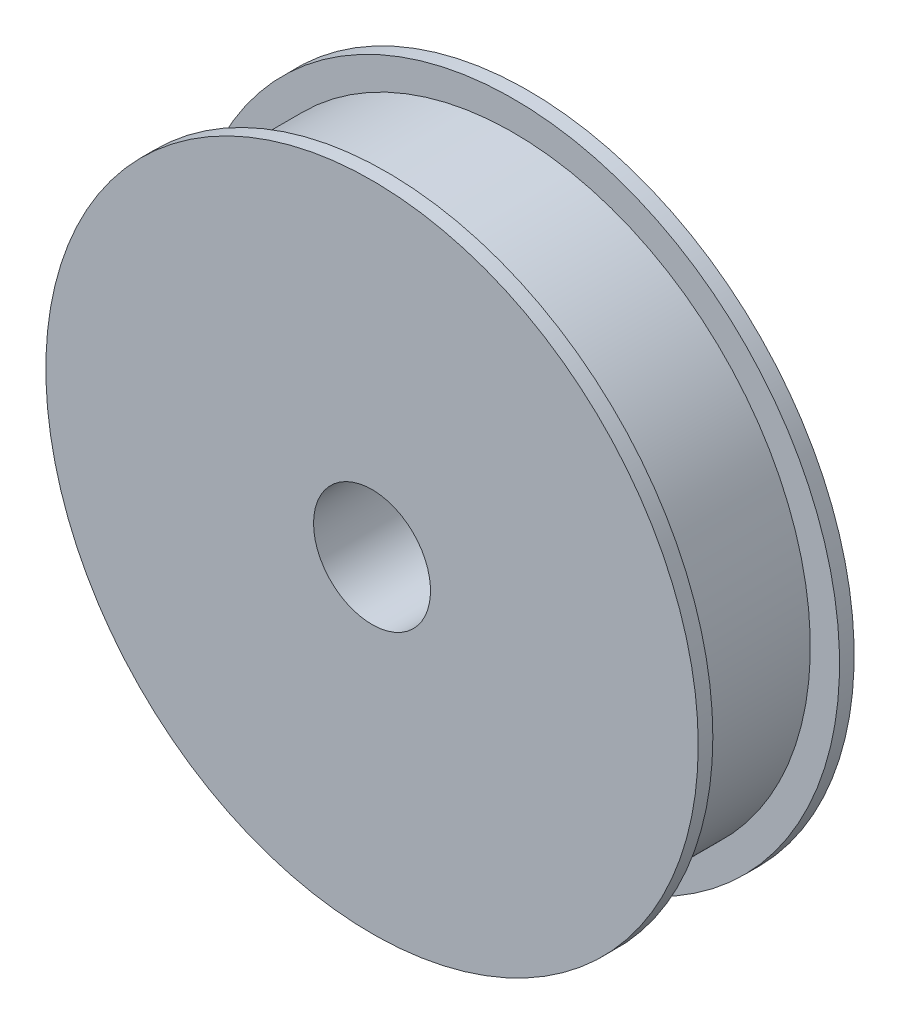
ISO-10303-21;
HEADER;
FILE_DESCRIPTION(('STEP AP214'),'2;1');
FILE_NAME('part.step','',(''),(''),'','','');
FILE_SCHEMA(('AUTOMOTIVE_DESIGN { 1 0 10303 214 1 1 1 1 }'));
ENDSEC;
DATA;
#1=APPLICATION_CONTEXT('core data for automotive mechanical design processes');
#2=APPLICATION_PROTOCOL_DEFINITION('international standard','automotive_design',2000,#1);
#3=PRODUCT_CONTEXT('',#1,'mechanical');
#4=PRODUCT('Part','Part','',(#3));
#5=PRODUCT_RELATED_PRODUCT_CATEGORY('part','',(#4));
#6=PRODUCT_DEFINITION_FORMATION('','',#4);
#7=PRODUCT_DEFINITION_CONTEXT('part definition',#1,'design');
#8=PRODUCT_DEFINITION('design','',#6,#7);
#9=PRODUCT_DEFINITION_SHAPE('','',#8);
#10=(LENGTH_UNIT() NAMED_UNIT(*) SI_UNIT(.MILLI.,.METRE.));
#11=(NAMED_UNIT(*) PLANE_ANGLE_UNIT() SI_UNIT($,.RADIAN.));
#12=(NAMED_UNIT(*) SI_UNIT($,.STERADIAN.) SOLID_ANGLE_UNIT());
#13=UNCERTAINTY_MEASURE_WITH_UNIT(LENGTH_MEASURE(1.E-05),#10,'distance_accuracy_value','');
#14=(GEOMETRIC_REPRESENTATION_CONTEXT(3) GLOBAL_UNCERTAINTY_ASSIGNED_CONTEXT((#13)) GLOBAL_UNIT_ASSIGNED_CONTEXT((#10,
#11,#12)) REPRESENTATION_CONTEXT('',''));
#15=CARTESIAN_POINT('',(0.,0.,0.));
#16=DIRECTION('',(0.,0.,1.));
#17=DIRECTION('',(1.,0.,0.));
#18=AXIS2_PLACEMENT_3D('',#15,#16,#17);
#19=CARTESIAN_POINT('',(0.,0.,14.5));
#20=DIRECTION('',(0.,0.,-1.));
#21=DIRECTION('',(-1.,0.,0.));
#22=AXIS2_PLACEMENT_3D('',#19,#20,#21);
#23=CYLINDRICAL_SURFACE('',#22,6.);
#24=CARTESIAN_POINT('',(0.,0.,14.5));
#25=DIRECTION('',(0.,0.,-1.));
#26=DIRECTION('',(-1.,0.,0.));
#27=AXIS2_PLACEMENT_3D('',#24,#25,#26);
#28=CIRCLE('',#27,6.);
#29=CARTESIAN_POINT('',(-6.,0.,14.5));
#30=VERTEX_POINT('',#29);
#31=EDGE_CURVE('E57',#30,#30,#28,.T.);
#32=ORIENTED_EDGE('',*,*,#31,.F.);
#33=EDGE_LOOP('',(#32));
#34=FACE_BOUND('',#33,.T.);
#35=CARTESIAN_POINT('',(0.,0.,3.5));
#36=DIRECTION('',(0.,0.,-1.));
#37=DIRECTION('',(-1.,0.,0.));
#38=AXIS2_PLACEMENT_3D('',#35,#36,#37);
#39=CIRCLE('',#38,6.);
#40=CARTESIAN_POINT('',(-6.,0.,3.5));
#41=VERTEX_POINT('',#40);
#42=EDGE_CURVE('E37',#41,#41,#39,.F.);
#43=ORIENTED_EDGE('',*,*,#42,.F.);
#44=EDGE_LOOP('',(#43));
#45=FACE_BOUND('',#44,.T.);
#46=ADVANCED_FACE('F33',(#34,#45),#23,.F.);
#47=CARTESIAN_POINT('',(0.,0.,13.));
#48=DIRECTION('',(0.,0.,-1.));
#49=DIRECTION('',(-1.,0.,0.));
#50=AXIS2_PLACEMENT_3D('',#47,#48,#49);
#51=CYLINDRICAL_SURFACE('',#50,30.47);
#52=CARTESIAN_POINT('',(0.,0.,13.));
#53=DIRECTION('',(0.,0.,1.));
#54=DIRECTION('',(1.,0.,0.));
#55=AXIS2_PLACEMENT_3D('',#52,#53,#54);
#56=CIRCLE('',#55,30.47);
#57=CARTESIAN_POINT('',(-30.47,0.,13.));
#58=VERTEX_POINT('',#57);
#59=EDGE_CURVE('E10',#58,#58,#56,.T.);
#60=CARTESIAN_POINT('',(0.,0.,0.));
#61=DIRECTION('',(0.,0.,-1.));
#62=DIRECTION('',(-1.,0.,0.));
#63=AXIS2_PLACEMENT_3D('',#60,#61,#62);
#64=CIRCLE('',#63,30.47);
#65=CARTESIAN_POINT('',(-30.47,0.,0.));
#66=VERTEX_POINT('',#65);
#67=EDGE_CURVE('E49',#66,#66,#64,.T.);
#68=CARTESIAN_POINT('',(-30.47,0.,13.));
#69=CARTESIAN_POINT('',(-30.47,0.,12.8645833333333));
#70=CARTESIAN_POINT('',(-30.47,0.,12.7291666666667));
#71=CARTESIAN_POINT('',(-30.47,0.,12.4583333333333));
#72=CARTESIAN_POINT('',(-30.47,0.,12.3229166666667));
#73=CARTESIAN_POINT('',(-30.47,0.,12.0520833333333));
#74=CARTESIAN_POINT('',(-30.47,0.,11.9166666666667));
#75=CARTESIAN_POINT('',(-30.47,0.,11.6458333333333));
#76=CARTESIAN_POINT('',(-30.47,0.,11.5104166666667));
#77=CARTESIAN_POINT('',(-30.47,0.,11.2395833333333));
#78=CARTESIAN_POINT('',(-30.47,0.,11.1041666666667));
#79=CARTESIAN_POINT('',(-30.47,0.,10.8333333333333));
#80=CARTESIAN_POINT('',(-30.47,0.,10.6979166666667));
#81=CARTESIAN_POINT('',(-30.47,0.,10.4270833333333));
#82=CARTESIAN_POINT('',(-30.47,0.,10.2916666666667));
#83=CARTESIAN_POINT('',(-30.47,0.,10.0208333333333));
#84=CARTESIAN_POINT('',(-30.47,0.,9.88541666666667));
#85=CARTESIAN_POINT('',(-30.47,0.,9.61458333333333));
#86=CARTESIAN_POINT('',(-30.47,0.,9.47916666666667));
#87=CARTESIAN_POINT('',(-30.47,0.,9.20833333333333));
#88=CARTESIAN_POINT('',(-30.47,0.,9.07291666666666));
#89=CARTESIAN_POINT('',(-30.47,0.,8.80208333333333));
#90=CARTESIAN_POINT('',(-30.47,0.,8.66666666666667));
#91=CARTESIAN_POINT('',(-30.47,0.,8.39583333333333));
#92=CARTESIAN_POINT('',(-30.47,0.,8.26041666666667));
#93=CARTESIAN_POINT('',(-30.47,0.,7.98958333333333));
#94=CARTESIAN_POINT('',(-30.47,0.,7.85416666666667));
#95=CARTESIAN_POINT('',(-30.47,0.,7.58333333333333));
#96=CARTESIAN_POINT('',(-30.47,0.,7.44791666666667));
#97=CARTESIAN_POINT('',(-30.47,0.,7.17708333333333));
#98=CARTESIAN_POINT('',(-30.47,0.,7.04166666666667));
#99=CARTESIAN_POINT('',(-30.47,0.,6.77083333333333));
#100=CARTESIAN_POINT('',(-30.47,0.,6.63541666666667));
#101=CARTESIAN_POINT('',(-30.47,0.,6.36458333333333));
#102=CARTESIAN_POINT('',(-30.47,0.,6.22916666666667));
#103=CARTESIAN_POINT('',(-30.47,0.,5.95833333333333));
#104=CARTESIAN_POINT('',(-30.47,0.,5.82291666666667));
#105=CARTESIAN_POINT('',(-30.47,0.,5.55208333333333));
#106=CARTESIAN_POINT('',(-30.47,0.,5.41666666666667));
#107=CARTESIAN_POINT('',(-30.47,0.,5.14583333333333));
#108=CARTESIAN_POINT('',(-30.47,0.,5.01041666666667));
#109=CARTESIAN_POINT('',(-30.47,0.,4.73958333333333));
#110=CARTESIAN_POINT('',(-30.47,0.,4.60416666666667));
#111=CARTESIAN_POINT('',(-30.47,0.,4.33333333333333));
#112=CARTESIAN_POINT('',(-30.47,0.,4.19791666666667));
#113=CARTESIAN_POINT('',(-30.47,0.,3.92708333333333));
#114=CARTESIAN_POINT('',(-30.47,0.,3.79166666666667));
#115=CARTESIAN_POINT('',(-30.47,0.,3.52083333333333));
#116=CARTESIAN_POINT('',(-30.47,0.,3.38541666666667));
#117=CARTESIAN_POINT('',(-30.47,0.,3.11458333333333));
#118=CARTESIAN_POINT('',(-30.47,0.,2.97916666666667));
#119=CARTESIAN_POINT('',(-30.47,0.,2.70833333333333));
#120=CARTESIAN_POINT('',(-30.47,0.,2.57291666666667));
#121=CARTESIAN_POINT('',(-30.47,0.,2.30208333333333));
#122=CARTESIAN_POINT('',(-30.47,0.,2.16666666666667));
#123=CARTESIAN_POINT('',(-30.47,0.,1.89583333333333));
#124=CARTESIAN_POINT('',(-30.47,0.,1.76041666666667));
#125=CARTESIAN_POINT('',(-30.47,0.,1.48958333333333));
#126=CARTESIAN_POINT('',(-30.47,0.,1.35416666666667));
#127=CARTESIAN_POINT('',(-30.47,0.,1.08333333333333));
#128=CARTESIAN_POINT('',(-30.47,0.,0.947916666666667));
#129=CARTESIAN_POINT('',(-30.47,0.,0.677083333333334));
#130=CARTESIAN_POINT('',(-30.47,0.,0.541666666666667));
#131=CARTESIAN_POINT('',(-30.47,0.,0.270833333333334));
#132=CARTESIAN_POINT('',(-30.47,0.,0.135416666666667));
#133=CARTESIAN_POINT('',(-30.47,0.,0.));
#134=B_SPLINE_CURVE_WITH_KNOTS('',3,(#68,#69,#70,#71,#72,#73,#74,#75,#76,#77,#78,#79,#80,#81,
#82,#83,#84,#85,#86,#87,#88,#89,#90,#91,#92,#93,#94,#95,#96,#97,#98,#99,#100,#101,#102,#103,
#104,#105,#106,#107,#108,#109,#110,#111,#112,#113,#114,#115,#116,#117,#118,#119,#120,#121,#122,
#123,#124,#125,#126,#127,#128,#129,#130,#131,#132,#133),.UNSPECIFIED.,.F.,.F.,(4,2,2,2,2,2,2,2,
2,2,2,2,2,2,2,2,2,2,2,2,2,2,2,2,2,2,2,2,2,2,2,2,4),(0.,0.40625,0.812500000000001,1.21875,1.625,
2.03125,2.4375,2.84375,3.25,3.65625,4.0625,4.46875,4.875,5.28125,5.6875,6.09375,6.5,6.90625,
7.3125,7.71875,8.125,8.53125,8.9375,9.34375,9.75,10.15625,10.5625,10.96875,11.375,11.78125,
12.1875,12.59375,13.),.UNSPECIFIED.);
#135=EDGE_CURVE('BSEAM35',#58,#66,#134,.T.);
#136=ORIENTED_EDGE('',*,*,#59,.F.);
#137=ORIENTED_EDGE('',*,*,#67,.F.);
#138=ORIENTED_EDGE('',*,*,#135,.T.);
#139=ORIENTED_EDGE('',*,*,#135,.F.);
#140=EDGE_LOOP('',(#136,#138,#137,#139));
#141=FACE_BOUND('',#140,.T.);
#142=ADVANCED_FACE('F35',(#141),#51,.T.);
#143=CARTESIAN_POINT('',(0.,0.,13.));
#144=DIRECTION('',(0.,0.,1.));
#145=DIRECTION('',(1.,0.,0.));
#146=AXIS2_PLACEMENT_3D('',#143,#144,#145);
#147=PLANE('',#146);
#148=CARTESIAN_POINT('',(0.,0.,13.));
#149=DIRECTION('',(0.,0.,1.));
#150=DIRECTION('',(1.,0.,0.));
#151=AXIS2_PLACEMENT_3D('',#148,#149,#150);
#152=CIRCLE('',#151,33.47);
#153=CARTESIAN_POINT('',(33.47,0.,13.));
#154=VERTEX_POINT('',#153);
#155=EDGE_CURVE('E45',#154,#154,#152,.T.);
#156=ORIENTED_EDGE('',*,*,#155,.F.);
#157=EDGE_LOOP('',(#156));
#158=FACE_BOUND('',#157,.T.);
#159=ORIENTED_EDGE('',*,*,#59,.T.);
#160=EDGE_LOOP('',(#159));
#161=FACE_BOUND('',#160,.T.);
#162=ADVANCED_FACE('F80',(#158,#161),#147,.F.);
#163=CARTESIAN_POINT('',(0.,0.,14.5));
#164=DIRECTION('',(0.,0.,-1.));
#165=DIRECTION('',(-1.,0.,0.));
#166=AXIS2_PLACEMENT_3D('',#163,#164,#165);
#167=CYLINDRICAL_SURFACE('',#166,33.47);
#168=CARTESIAN_POINT('',(0.,0.,14.5));
#169=DIRECTION('',(0.,0.,1.));
#170=DIRECTION('',(1.,0.,0.));
#171=AXIS2_PLACEMENT_3D('',#168,#169,#170);
#172=CIRCLE('',#171,33.47);
#173=CARTESIAN_POINT('',(33.47,0.,14.5));
#174=VERTEX_POINT('',#173);
#175=EDGE_CURVE('E41',#174,#174,#172,.T.);
#176=ORIENTED_EDGE('',*,*,#175,.F.);
#177=EDGE_LOOP('',(#176));
#178=FACE_BOUND('',#177,.T.);
#179=ORIENTED_EDGE('',*,*,#155,.T.);
#180=EDGE_LOOP('',(#179));
#181=FACE_BOUND('',#180,.T.);
#182=ADVANCED_FACE('F102',(#178,#181),#167,.T.);
#183=CARTESIAN_POINT('',(0.,0.,14.5));
#184=DIRECTION('',(0.,0.,1.));
#185=DIRECTION('',(1.,0.,0.));
#186=AXIS2_PLACEMENT_3D('',#183,#184,#185);
#187=PLANE('',#186);
#188=ORIENTED_EDGE('',*,*,#31,.T.);
#189=EDGE_LOOP('',(#188));
#190=FACE_BOUND('',#189,.T.);
#191=ORIENTED_EDGE('',*,*,#175,.T.);
#192=EDGE_LOOP('',(#191));
#193=FACE_BOUND('',#192,.T.);
#194=ADVANCED_FACE('F95',(#190,#193),#187,.T.);
#195=CARTESIAN_POINT('',(0.,0.,0.));
#196=DIRECTION('',(0.,0.,-1.));
#197=DIRECTION('',(-1.,0.,0.));
#198=AXIS2_PLACEMENT_3D('',#195,#196,#197);
#199=PLANE('',#198);
#200=CARTESIAN_POINT('',(0.,0.,0.));
#201=DIRECTION('',(0.,0.,-1.));
#202=DIRECTION('',(-1.,0.,0.));
#203=AXIS2_PLACEMENT_3D('',#200,#201,#202);
#204=CIRCLE('',#203,33.47);
#205=CARTESIAN_POINT('',(-33.47,0.,0.));
#206=VERTEX_POINT('',#205);
#207=EDGE_CURVE('E54',#206,#206,#204,.T.);
#208=ORIENTED_EDGE('',*,*,#207,.F.);
#209=EDGE_LOOP('',(#208));
#210=FACE_BOUND('',#209,.T.);
#211=ORIENTED_EDGE('',*,*,#67,.T.);
#212=EDGE_LOOP('',(#211));
#213=FACE_BOUND('',#212,.T.);
#214=ADVANCED_FACE('F92',(#210,#213),#199,.F.);
#215=CARTESIAN_POINT('',(0.,0.,-1.5));
#216=DIRECTION('',(0.,0.,1.));
#217=DIRECTION('',(1.,0.,0.));
#218=AXIS2_PLACEMENT_3D('',#215,#216,#217);
#219=CYLINDRICAL_SURFACE('',#218,33.47);
#220=CARTESIAN_POINT('',(0.,0.,-1.5));
#221=DIRECTION('',(0.,0.,-1.));
#222=DIRECTION('',(-1.,0.,0.));
#223=AXIS2_PLACEMENT_3D('',#220,#221,#222);
#224=CIRCLE('',#223,33.47);
#225=CARTESIAN_POINT('',(-33.47,0.,-1.5));
#226=VERTEX_POINT('',#225);
#227=EDGE_CURVE('E53',#226,#226,#224,.T.);
#228=ORIENTED_EDGE('',*,*,#227,.F.);
#229=EDGE_LOOP('',(#228));
#230=FACE_BOUND('',#229,.T.);
#231=ORIENTED_EDGE('',*,*,#207,.T.);
#232=EDGE_LOOP('',(#231));
#233=FACE_BOUND('',#232,.T.);
#234=ADVANCED_FACE('F90',(#230,#233),#219,.T.);
#235=CARTESIAN_POINT('',(0.,0.,-1.5));
#236=DIRECTION('',(0.,0.,-1.));
#237=DIRECTION('',(-1.,0.,0.));
#238=AXIS2_PLACEMENT_3D('',#235,#236,#237);
#239=PLANE('',#238);
#240=CARTESIAN_POINT('',(0.,0.,-1.5));
#241=DIRECTION('',(0.,0.,-1.));
#242=DIRECTION('',(-1.,0.,0.));
#243=AXIS2_PLACEMENT_3D('',#240,#241,#242);
#244=CIRCLE('',#243,10.);
#245=CARTESIAN_POINT('',(-10.,0.,-1.5));
#246=VERTEX_POINT('',#245);
#247=EDGE_CURVE('E62',#246,#246,#244,.T.);
#248=ORIENTED_EDGE('',*,*,#247,.F.);
#249=EDGE_LOOP('',(#248));
#250=FACE_BOUND('',#249,.T.);
#251=ORIENTED_EDGE('',*,*,#227,.T.);
#252=EDGE_LOOP('',(#251));
#253=FACE_BOUND('',#252,.T.);
#254=ADVANCED_FACE('F87',(#250,#253),#239,.T.);
#255=CARTESIAN_POINT('',(0.,0.,3.5));
#256=DIRECTION('',(0.,0.,-1.));
#257=DIRECTION('',(-1.,0.,0.));
#258=AXIS2_PLACEMENT_3D('',#255,#256,#257);
#259=PLANE('',#258);
#260=CARTESIAN_POINT('',(0.,0.,3.5));
#261=DIRECTION('',(0.,0.,-1.));
#262=DIRECTION('',(-1.,0.,0.));
#263=AXIS2_PLACEMENT_3D('',#260,#261,#262);
#264=CIRCLE('',#263,10.);
#265=CARTESIAN_POINT('',(-10.,0.,3.5));
#266=VERTEX_POINT('',#265);
#267=EDGE_CURVE('E65',#266,#266,#264,.T.);
#268=ORIENTED_EDGE('',*,*,#267,.T.);
#269=EDGE_LOOP('',(#268));
#270=FACE_BOUND('',#269,.T.);
#271=ORIENTED_EDGE('',*,*,#42,.T.);
#272=EDGE_LOOP('',(#271));
#273=FACE_BOUND('',#272,.T.);
#274=ADVANCED_FACE('F72',(#270,#273),#259,.T.);
#275=CARTESIAN_POINT('',(0.,0.,3.5));
#276=DIRECTION('',(0.,0.,-1.));
#277=DIRECTION('',(-1.,0.,0.));
#278=AXIS2_PLACEMENT_3D('',#275,#276,#277);
#279=CYLINDRICAL_SURFACE('',#278,10.);
#280=ORIENTED_EDGE('',*,*,#267,.F.);
#281=EDGE_LOOP('',(#280));
#282=FACE_BOUND('',#281,.T.);
#283=ORIENTED_EDGE('',*,*,#247,.T.);
#284=EDGE_LOOP('',(#283));
#285=FACE_BOUND('',#284,.T.);
#286=ADVANCED_FACE('F85',(#282,#285),#279,.F.);
#287=CLOSED_SHELL('',(#46,#142,#162,#182,#194,#214,#234,#254,#274,#286));
#288=MANIFOLD_SOLID_BREP('B2',#287);
#289=ADVANCED_BREP_SHAPE_REPRESENTATION('',(#18,#288),#14);
#290=SHAPE_DEFINITION_REPRESENTATION(#9,#289);
ENDSEC;
END-ISO-10303-21;
